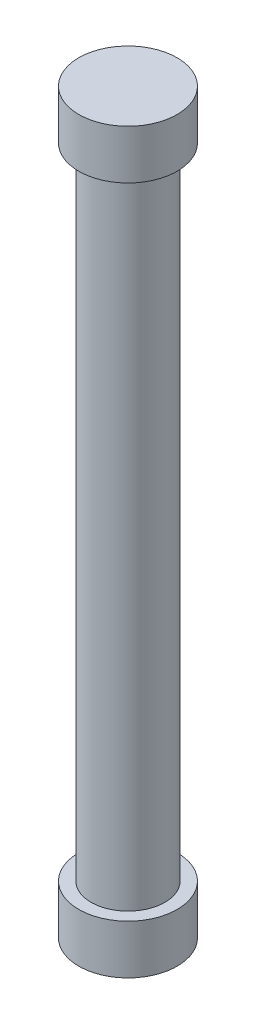
ISO-10303-21;
HEADER;
FILE_DESCRIPTION(('STEP AP214'),'2;1');
FILE_NAME('part.step','',(''),(''),'','','');
FILE_SCHEMA(('AUTOMOTIVE_DESIGN { 1 0 10303 214 1 1 1 1 }'));
ENDSEC;
DATA;
#1=APPLICATION_CONTEXT('core data for automotive mechanical design processes');
#2=APPLICATION_PROTOCOL_DEFINITION('international standard','automotive_design',2000,#1);
#3=PRODUCT_CONTEXT('',#1,'mechanical');
#4=PRODUCT('Part','Part','',(#3));
#5=PRODUCT_RELATED_PRODUCT_CATEGORY('part','',(#4));
#6=PRODUCT_DEFINITION_FORMATION('','',#4);
#7=PRODUCT_DEFINITION_CONTEXT('part definition',#1,'design');
#8=PRODUCT_DEFINITION('design','',#6,#7);
#9=PRODUCT_DEFINITION_SHAPE('','',#8);
#10=(LENGTH_UNIT() NAMED_UNIT(*) SI_UNIT(.MILLI.,.METRE.));
#11=(NAMED_UNIT(*) PLANE_ANGLE_UNIT() SI_UNIT($,.RADIAN.));
#12=(NAMED_UNIT(*) SI_UNIT($,.STERADIAN.) SOLID_ANGLE_UNIT());
#13=UNCERTAINTY_MEASURE_WITH_UNIT(LENGTH_MEASURE(1.E-05),#10,'distance_accuracy_value','');
#14=(GEOMETRIC_REPRESENTATION_CONTEXT(3) GLOBAL_UNCERTAINTY_ASSIGNED_CONTEXT((#13)) GLOBAL_UNIT_ASSIGNED_CONTEXT((#10,
#11,#12)) REPRESENTATION_CONTEXT('',''));
#15=CARTESIAN_POINT('',(0.,0.,0.));
#16=DIRECTION('',(0.,0.,1.));
#17=DIRECTION('',(1.,0.,0.));
#18=AXIS2_PLACEMENT_3D('',#15,#16,#17);
#19=CARTESIAN_POINT('',(-2.,23.3,0.));
#20=DIRECTION('',(0.,1.,0.));
#21=DIRECTION('',(-1.,0.,0.));
#22=AXIS2_PLACEMENT_3D('',#19,#20,#21);
#23=PLANE('',#22);
#24=CARTESIAN_POINT('',(0.,23.3,0.));
#25=DIRECTION('',(0.,1.,0.));
#26=DIRECTION('',(-1.,0.,0.));
#27=AXIS2_PLACEMENT_3D('',#24,#25,#26);
#28=CIRCLE('',#27,2.);
#29=CARTESIAN_POINT('',(-2.,23.3,0.));
#30=VERTEX_POINT('',#29);
#31=EDGE_CURVE('E53',#30,#30,#28,.T.);
#32=ORIENTED_EDGE('',*,*,#31,.T.);
#33=EDGE_LOOP('',(#32));
#34=FACE_BOUND('',#33,.T.);
#35=ADVANCED_FACE('F31',(#34),#23,.T.);
#36=CARTESIAN_POINT('',(0.,-6.7,0.));
#37=DIRECTION('',(0.,-1.,0.));
#38=DIRECTION('',(1.,0.,0.));
#39=AXIS2_PLACEMENT_3D('',#36,#37,#38);
#40=PLANE('',#39);
#41=CARTESIAN_POINT('',(0.,-6.7,0.));
#42=DIRECTION('',(0.,1.,0.));
#43=DIRECTION('',(-1.,0.,0.));
#44=AXIS2_PLACEMENT_3D('',#41,#42,#43);
#45=CIRCLE('',#44,2.);
#46=CARTESIAN_POINT('',(-2.,-6.7,0.));
#47=VERTEX_POINT('',#46);
#48=EDGE_CURVE('E10',#47,#47,#45,.T.);
#49=ORIENTED_EDGE('',*,*,#48,.F.);
#50=EDGE_LOOP('',(#49));
#51=FACE_BOUND('',#50,.T.);
#52=ADVANCED_FACE('F70',(#51),#40,.T.);
#53=CARTESIAN_POINT('',(0.,23.3,0.));
#54=DIRECTION('',(0.,1.,0.));
#55=DIRECTION('',(-1.,0.,0.));
#56=AXIS2_PLACEMENT_3D('',#53,#54,#55);
#57=CYLINDRICAL_SURFACE('',#56,2.);
#58=ORIENTED_EDGE('',*,*,#48,.T.);
#59=EDGE_LOOP('',(#58));
#60=FACE_BOUND('',#59,.T.);
#61=CARTESIAN_POINT('',(0.,-4.7,0.));
#62=DIRECTION('',(0.,1.,0.));
#63=DIRECTION('',(-1.,0.,0.));
#64=AXIS2_PLACEMENT_3D('',#61,#62,#63);
#65=CIRCLE('',#64,2.);
#66=CARTESIAN_POINT('',(-2.,-4.7,0.));
#67=VERTEX_POINT('',#66);
#68=EDGE_CURVE('E37',#67,#67,#65,.T.);
#69=ORIENTED_EDGE('',*,*,#68,.F.);
#70=EDGE_LOOP('',(#69));
#71=FACE_BOUND('',#70,.T.);
#72=ADVANCED_FACE('F74',(#60,#71),#57,.T.);
#73=CARTESIAN_POINT('',(-2.,-4.7,0.));
#74=DIRECTION('',(0.,1.,0.));
#75=DIRECTION('',(-1.,0.,0.));
#76=AXIS2_PLACEMENT_3D('',#73,#74,#75);
#77=PLANE('',#76);
#78=ORIENTED_EDGE('',*,*,#68,.T.);
#79=EDGE_LOOP('',(#78));
#80=FACE_BOUND('',#79,.T.);
#81=CARTESIAN_POINT('',(0.,-4.7,0.));
#82=DIRECTION('',(0.,1.,0.));
#83=DIRECTION('',(-1.,0.,0.));
#84=AXIS2_PLACEMENT_3D('',#81,#82,#83);
#85=CIRCLE('',#84,1.5);
#86=CARTESIAN_POINT('',(-1.5,-4.7,0.));
#87=VERTEX_POINT('',#86);
#88=EDGE_CURVE('E41',#87,#87,#85,.T.);
#89=ORIENTED_EDGE('',*,*,#88,.F.);
#90=EDGE_LOOP('',(#89));
#91=FACE_BOUND('',#90,.T.);
#92=ADVANCED_FACE('F79',(#80,#91),#77,.T.);
#93=CARTESIAN_POINT('',(0.,23.3,0.));
#94=DIRECTION('',(0.,1.,0.));
#95=DIRECTION('',(-1.,0.,0.));
#96=AXIS2_PLACEMENT_3D('',#93,#94,#95);
#97=CYLINDRICAL_SURFACE('',#96,1.5);
#98=ORIENTED_EDGE('',*,*,#88,.T.);
#99=EDGE_LOOP('',(#98));
#100=FACE_BOUND('',#99,.T.);
#101=CARTESIAN_POINT('',(0.,21.3,0.));
#102=DIRECTION('',(0.,1.,0.));
#103=DIRECTION('',(-1.,0.,0.));
#104=AXIS2_PLACEMENT_3D('',#101,#102,#103);
#105=CIRCLE('',#104,1.5);
#106=CARTESIAN_POINT('',(-1.5,21.3,0.));
#107=VERTEX_POINT('',#106);
#108=EDGE_CURVE('E45',#107,#107,#105,.T.);
#109=ORIENTED_EDGE('',*,*,#108,.F.);
#110=EDGE_LOOP('',(#109));
#111=FACE_BOUND('',#110,.T.);
#112=ADVANCED_FACE('F66',(#100,#111),#97,.T.);
#113=CARTESIAN_POINT('',(-1.5,21.3,0.));
#114=DIRECTION('',(0.,-1.,0.));
#115=DIRECTION('',(1.,0.,0.));
#116=AXIS2_PLACEMENT_3D('',#113,#114,#115);
#117=PLANE('',#116);
#118=ORIENTED_EDGE('',*,*,#108,.T.);
#119=EDGE_LOOP('',(#118));
#120=FACE_BOUND('',#119,.T.);
#121=CARTESIAN_POINT('',(0.,21.3,0.));
#122=DIRECTION('',(0.,1.,0.));
#123=DIRECTION('',(-1.,0.,0.));
#124=AXIS2_PLACEMENT_3D('',#121,#122,#123);
#125=CIRCLE('',#124,2.);
#126=CARTESIAN_POINT('',(-2.,21.3,0.));
#127=VERTEX_POINT('',#126);
#128=EDGE_CURVE('E50',#127,#127,#125,.T.);
#129=ORIENTED_EDGE('',*,*,#128,.F.);
#130=EDGE_LOOP('',(#129));
#131=FACE_BOUND('',#130,.T.);
#132=ADVANCED_FACE('F60',(#120,#131),#117,.T.);
#133=CARTESIAN_POINT('',(0.,23.3,0.));
#134=DIRECTION('',(0.,1.,0.));
#135=DIRECTION('',(-1.,0.,0.));
#136=AXIS2_PLACEMENT_3D('',#133,#134,#135);
#137=CYLINDRICAL_SURFACE('',#136,2.);
#138=ORIENTED_EDGE('',*,*,#128,.T.);
#139=EDGE_LOOP('',(#138));
#140=FACE_BOUND('',#139,.T.);
#141=ORIENTED_EDGE('',*,*,#31,.F.);
#142=EDGE_LOOP('',(#141));
#143=FACE_BOUND('',#142,.T.);
#144=ADVANCED_FACE('F58',(#140,#143),#137,.T.);
#145=CLOSED_SHELL('',(#35,#52,#72,#92,#112,#132,#144));
#146=MANIFOLD_SOLID_BREP('B2',#145);
#147=ADVANCED_BREP_SHAPE_REPRESENTATION('',(#18,#146),#14);
#148=SHAPE_DEFINITION_REPRESENTATION(#9,#147);
ENDSEC;
END-ISO-10303-21;
